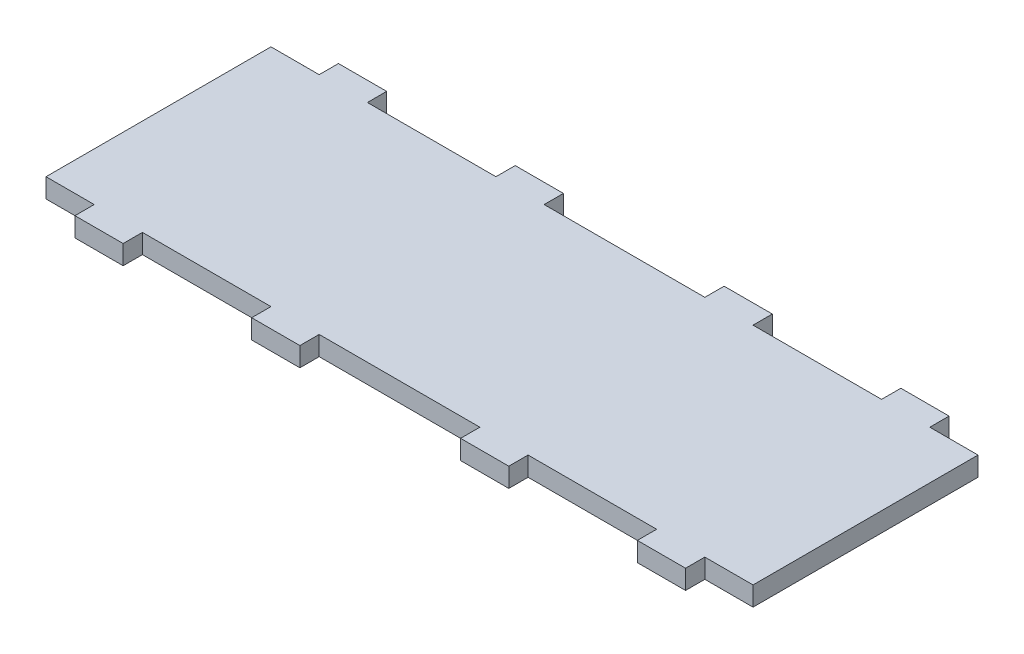
ISO-10303-21;
HEADER;
FILE_DESCRIPTION(('STEP AP214'),'2;1');
FILE_NAME('part.step','',(''),(''),'','','');
FILE_SCHEMA(('AUTOMOTIVE_DESIGN { 1 0 10303 214 1 1 1 1 }'));
ENDSEC;
DATA;
#1=APPLICATION_CONTEXT('core data for automotive mechanical design processes');
#2=APPLICATION_PROTOCOL_DEFINITION('international standard','automotive_design',2000,#1);
#3=PRODUCT_CONTEXT('',#1,'mechanical');
#4=PRODUCT('Part','Part','',(#3));
#5=PRODUCT_RELATED_PRODUCT_CATEGORY('part','',(#4));
#6=PRODUCT_DEFINITION_FORMATION('','',#4);
#7=PRODUCT_DEFINITION_CONTEXT('part definition',#1,'design');
#8=PRODUCT_DEFINITION('design','',#6,#7);
#9=PRODUCT_DEFINITION_SHAPE('','',#8);
#10=(LENGTH_UNIT() NAMED_UNIT(*) SI_UNIT(.MILLI.,.METRE.));
#11=(NAMED_UNIT(*) PLANE_ANGLE_UNIT() SI_UNIT($,.RADIAN.));
#12=(NAMED_UNIT(*) SI_UNIT($,.STERADIAN.) SOLID_ANGLE_UNIT());
#13=UNCERTAINTY_MEASURE_WITH_UNIT(LENGTH_MEASURE(1.E-05),#10,'distance_accuracy_value','');
#14=(GEOMETRIC_REPRESENTATION_CONTEXT(3) GLOBAL_UNCERTAINTY_ASSIGNED_CONTEXT((#13)) GLOBAL_UNIT_ASSIGNED_CONTEXT((#10,
#11,#12)) REPRESENTATION_CONTEXT('',''));
#15=CARTESIAN_POINT('',(0.,0.,0.));
#16=DIRECTION('',(0.,0.,1.));
#17=DIRECTION('',(1.,0.,0.));
#18=AXIS2_PLACEMENT_3D('',#15,#16,#17);
#19=CARTESIAN_POINT('',(-365.386748431959,6.,-70.));
#20=DIRECTION('',(1.,0.,0.));
#21=DIRECTION('',(0.,0.,-1.));
#22=AXIS2_PLACEMENT_3D('',#19,#20,#21);
#23=PLANE('',#22);
#24=DIRECTION('',(0.,0.,1.));
#25=VECTOR('',#24,1.);
#26=CARTESIAN_POINT('',(-365.386748431959,0.,-70.));
#27=LINE('',#26,#25);
#28=CARTESIAN_POINT('',(-365.386748431959,0.,-70.));
#29=VERTEX_POINT('',#28);
#30=CARTESIAN_POINT('',(-365.386748431959,0.,0.));
#31=VERTEX_POINT('',#30);
#32=EDGE_CURVE('E297',#29,#31,#27,.T.);
#33=ORIENTED_EDGE('',*,*,#32,.T.);
#34=DIRECTION('',(0.,-1.,0.));
#35=VECTOR('',#34,1.);
#36=CARTESIAN_POINT('',(-365.386748431959,6.,0.));
#37=LINE('',#36,#35);
#38=CARTESIAN_POINT('',(-365.386748431959,6.,0.));
#39=VERTEX_POINT('',#38);
#40=EDGE_CURVE('E11',#39,#31,#37,.T.);
#41=ORIENTED_EDGE('',*,*,#40,.F.);
#42=DIRECTION('',(0.,0.,1.));
#43=VECTOR('',#42,1.);
#44=CARTESIAN_POINT('',(-365.386748431959,6.,-70.));
#45=LINE('',#44,#43);
#46=CARTESIAN_POINT('',(-365.386748431959,6.,-70.));
#47=VERTEX_POINT('',#46);
#48=EDGE_CURVE('E367',#47,#39,#45,.T.);
#49=ORIENTED_EDGE('',*,*,#48,.F.);
#50=DIRECTION('',(0.,-1.,0.));
#51=VECTOR('',#50,1.);
#52=CARTESIAN_POINT('',(-365.386748431959,6.,-70.));
#53=LINE('',#52,#51);
#54=EDGE_CURVE('E293',#47,#29,#53,.T.);
#55=ORIENTED_EDGE('',*,*,#54,.T.);
#56=EDGE_LOOP('',(#33,#41,#49,#55));
#57=FACE_BOUND('',#56,.T.);
#58=ADVANCED_FACE('F33',(#57),#23,.F.);
#59=CARTESIAN_POINT('',(-365.386748431959,6.,0.));
#60=DIRECTION('',(0.,0.,-1.));
#61=DIRECTION('',(-1.,0.,0.));
#62=AXIS2_PLACEMENT_3D('',#59,#60,#61);
#63=PLANE('',#62);
#64=DIRECTION('',(1.,0.,0.));
#65=VECTOR('',#64,1.);
#66=CARTESIAN_POINT('',(-365.386748431959,0.,0.));
#67=LINE('',#66,#65);
#68=CARTESIAN_POINT('',(-350.386748431959,0.,0.));
#69=VERTEX_POINT('',#68);
#70=EDGE_CURVE('E300',#31,#69,#67,.T.);
#71=ORIENTED_EDGE('',*,*,#70,.T.);
#72=DIRECTION('',(0.,-1.,0.));
#73=VECTOR('',#72,1.);
#74=CARTESIAN_POINT('',(-350.386748431959,6.,0.));
#75=LINE('',#74,#73);
#76=CARTESIAN_POINT('',(-350.386748431959,6.,0.));
#77=VERTEX_POINT('',#76);
#78=EDGE_CURVE('E41',#77,#69,#75,.T.);
#79=ORIENTED_EDGE('',*,*,#78,.F.);
#80=DIRECTION('',(1.,0.,0.));
#81=VECTOR('',#80,1.);
#82=CARTESIAN_POINT('',(-365.386748431959,6.,0.));
#83=LINE('',#82,#81);
#84=EDGE_CURVE('E176',#39,#77,#83,.T.);
#85=ORIENTED_EDGE('',*,*,#84,.F.);
#86=ORIENTED_EDGE('',*,*,#40,.T.);
#87=EDGE_LOOP('',(#71,#79,#85,#86));
#88=FACE_BOUND('',#87,.T.);
#89=ADVANCED_FACE('F565',(#88),#63,.F.);
#90=CARTESIAN_POINT('',(-350.386748431959,6.,0.));
#91=DIRECTION('',(1.,0.,0.));
#92=DIRECTION('',(0.,0.,-1.));
#93=AXIS2_PLACEMENT_3D('',#90,#91,#92);
#94=PLANE('',#93);
#95=DIRECTION('',(0.,0.,1.));
#96=VECTOR('',#95,1.);
#97=CARTESIAN_POINT('',(-350.386748431959,0.,0.));
#98=LINE('',#97,#96);
#99=CARTESIAN_POINT('',(-350.386748431959,0.,6.));
#100=VERTEX_POINT('',#99);
#101=EDGE_CURVE('E302',#69,#100,#98,.T.);
#102=ORIENTED_EDGE('',*,*,#101,.T.);
#103=DIRECTION('',(0.,-1.,0.));
#104=VECTOR('',#103,1.);
#105=CARTESIAN_POINT('',(-350.386748431959,6.,6.));
#106=LINE('',#105,#104);
#107=CARTESIAN_POINT('',(-350.386748431959,6.,6.));
#108=VERTEX_POINT('',#107);
#109=EDGE_CURVE('E458',#108,#100,#106,.T.);
#110=ORIENTED_EDGE('',*,*,#109,.F.);
#111=DIRECTION('',(0.,0.,1.));
#112=VECTOR('',#111,1.);
#113=CARTESIAN_POINT('',(-350.386748431959,6.,0.));
#114=LINE('',#113,#112);
#115=EDGE_CURVE('E466',#77,#108,#114,.T.);
#116=ORIENTED_EDGE('',*,*,#115,.F.);
#117=ORIENTED_EDGE('',*,*,#78,.T.);
#118=EDGE_LOOP('',(#102,#110,#116,#117));
#119=FACE_BOUND('',#118,.T.);
#120=ADVANCED_FACE('F464',(#119),#94,.F.);
#121=CARTESIAN_POINT('',(-350.386748431959,6.,6.));
#122=DIRECTION('',(0.,0.,-1.));
#123=DIRECTION('',(-1.,0.,0.));
#124=AXIS2_PLACEMENT_3D('',#121,#122,#123);
#125=PLANE('',#124);
#126=DIRECTION('',(1.,0.,0.));
#127=VECTOR('',#126,1.);
#128=CARTESIAN_POINT('',(-350.386748431959,0.,6.));
#129=LINE('',#128,#127);
#130=CARTESIAN_POINT('',(-335.386748431959,0.,6.));
#131=VERTEX_POINT('',#130);
#132=EDGE_CURVE('E304',#100,#131,#129,.T.);
#133=ORIENTED_EDGE('',*,*,#132,.T.);
#134=DIRECTION('',(0.,-1.,0.));
#135=VECTOR('',#134,1.);
#136=CARTESIAN_POINT('',(-335.386748431959,6.,6.));
#137=LINE('',#136,#135);
#138=CARTESIAN_POINT('',(-335.386748431959,6.,6.));
#139=VERTEX_POINT('',#138);
#140=EDGE_CURVE('E455',#139,#131,#137,.T.);
#141=ORIENTED_EDGE('',*,*,#140,.F.);
#142=DIRECTION('',(1.,0.,0.));
#143=VECTOR('',#142,1.);
#144=CARTESIAN_POINT('',(-350.386748431959,6.,6.));
#145=LINE('',#144,#143);
#146=EDGE_CURVE('E484',#108,#139,#145,.T.);
#147=ORIENTED_EDGE('',*,*,#146,.F.);
#148=ORIENTED_EDGE('',*,*,#109,.T.);
#149=EDGE_LOOP('',(#133,#141,#147,#148));
#150=FACE_BOUND('',#149,.T.);
#151=ADVANCED_FACE('F475',(#150),#125,.F.);
#152=CARTESIAN_POINT('',(-335.386748431959,6.,0.));
#153=DIRECTION('',(-1.,0.,0.));
#154=DIRECTION('',(0.,0.,1.));
#155=AXIS2_PLACEMENT_3D('',#152,#153,#154);
#156=PLANE('',#155);
#157=DIRECTION('',(0.,0.,-1.));
#158=VECTOR('',#157,1.);
#159=CARTESIAN_POINT('',(-335.386748431959,0.,0.));
#160=LINE('',#159,#158);
#161=CARTESIAN_POINT('',(-335.386748431959,0.,0.));
#162=VERTEX_POINT('',#161);
#163=EDGE_CURVE('E306',#131,#162,#160,.T.);
#164=ORIENTED_EDGE('',*,*,#163,.T.);
#165=DIRECTION('',(0.,-1.,0.));
#166=VECTOR('',#165,1.);
#167=CARTESIAN_POINT('',(-335.386748431959,6.,0.));
#168=LINE('',#167,#166);
#169=CARTESIAN_POINT('',(-335.386748431959,6.,0.));
#170=VERTEX_POINT('',#169);
#171=EDGE_CURVE('E452',#170,#162,#168,.T.);
#172=ORIENTED_EDGE('',*,*,#171,.F.);
#173=DIRECTION('',(0.,0.,-1.));
#174=VECTOR('',#173,1.);
#175=CARTESIAN_POINT('',(-335.386748431959,6.,0.));
#176=LINE('',#175,#174);
#177=EDGE_CURVE('E481',#139,#170,#176,.T.);
#178=ORIENTED_EDGE('',*,*,#177,.F.);
#179=ORIENTED_EDGE('',*,*,#140,.T.);
#180=EDGE_LOOP('',(#164,#172,#178,#179));
#181=FACE_BOUND('',#180,.T.);
#182=ADVANCED_FACE('F479',(#181),#156,.F.);
#183=CARTESIAN_POINT('',(-335.386748431959,6.,0.));
#184=DIRECTION('',(0.,0.,-1.));
#185=DIRECTION('',(-1.,0.,0.));
#186=AXIS2_PLACEMENT_3D('',#183,#184,#185);
#187=PLANE('',#186);
#188=DIRECTION('',(1.,0.,0.));
#189=VECTOR('',#188,1.);
#190=CARTESIAN_POINT('',(-335.386748431959,0.,0.));
#191=LINE('',#190,#189);
#192=CARTESIAN_POINT('',(-295.386748431959,0.,0.));
#193=VERTEX_POINT('',#192);
#194=EDGE_CURVE('E308',#162,#193,#191,.T.);
#195=ORIENTED_EDGE('',*,*,#194,.T.);
#196=DIRECTION('',(0.,-1.,0.));
#197=VECTOR('',#196,1.);
#198=CARTESIAN_POINT('',(-295.386748431959,6.,0.));
#199=LINE('',#198,#197);
#200=CARTESIAN_POINT('',(-295.386748431959,6.,0.));
#201=VERTEX_POINT('',#200);
#202=EDGE_CURVE('E449',#201,#193,#199,.T.);
#203=ORIENTED_EDGE('',*,*,#202,.F.);
#204=DIRECTION('',(1.,0.,0.));
#205=VECTOR('',#204,1.);
#206=CARTESIAN_POINT('',(-335.386748431959,6.,0.));
#207=LINE('',#206,#205);
#208=EDGE_CURVE('E483',#170,#201,#207,.T.);
#209=ORIENTED_EDGE('',*,*,#208,.F.);
#210=ORIENTED_EDGE('',*,*,#171,.T.);
#211=EDGE_LOOP('',(#195,#203,#209,#210));
#212=FACE_BOUND('',#211,.T.);
#213=ADVANCED_FACE('F578',(#212),#187,.F.);
#214=CARTESIAN_POINT('',(-295.386748431959,6.,0.));
#215=DIRECTION('',(1.,0.,0.));
#216=DIRECTION('',(0.,0.,-1.));
#217=AXIS2_PLACEMENT_3D('',#214,#215,#216);
#218=PLANE('',#217);
#219=DIRECTION('',(0.,0.,1.));
#220=VECTOR('',#219,1.);
#221=CARTESIAN_POINT('',(-295.386748431959,0.,0.));
#222=LINE('',#221,#220);
#223=CARTESIAN_POINT('',(-295.386748431959,0.,6.));
#224=VERTEX_POINT('',#223);
#225=EDGE_CURVE('E310',#193,#224,#222,.T.);
#226=ORIENTED_EDGE('',*,*,#225,.T.);
#227=DIRECTION('',(0.,-1.,0.));
#228=VECTOR('',#227,1.);
#229=CARTESIAN_POINT('',(-295.386748431959,6.,6.));
#230=LINE('',#229,#228);
#231=CARTESIAN_POINT('',(-295.386748431959,6.,6.));
#232=VERTEX_POINT('',#231);
#233=EDGE_CURVE('E446',#232,#224,#230,.T.);
#234=ORIENTED_EDGE('',*,*,#233,.F.);
#235=DIRECTION('',(0.,0.,1.));
#236=VECTOR('',#235,1.);
#237=CARTESIAN_POINT('',(-295.386748431959,6.,0.));
#238=LINE('',#237,#236);
#239=EDGE_CURVE('E486',#201,#232,#238,.T.);
#240=ORIENTED_EDGE('',*,*,#239,.F.);
#241=ORIENTED_EDGE('',*,*,#202,.T.);
#242=EDGE_LOOP('',(#226,#234,#240,#241));
#243=FACE_BOUND('',#242,.T.);
#244=ADVANCED_FACE('F581',(#243),#218,.F.);
#245=CARTESIAN_POINT('',(-295.386748431959,6.,6.));
#246=DIRECTION('',(0.,0.,-1.));
#247=DIRECTION('',(-1.,0.,0.));
#248=AXIS2_PLACEMENT_3D('',#245,#246,#247);
#249=PLANE('',#248);
#250=DIRECTION('',(1.,0.,0.));
#251=VECTOR('',#250,1.);
#252=CARTESIAN_POINT('',(-295.386748431959,0.,6.));
#253=LINE('',#252,#251);
#254=CARTESIAN_POINT('',(-280.386748431959,0.,6.));
#255=VERTEX_POINT('',#254);
#256=EDGE_CURVE('E312',#224,#255,#253,.T.);
#257=ORIENTED_EDGE('',*,*,#256,.T.);
#258=DIRECTION('',(0.,-1.,0.));
#259=VECTOR('',#258,1.);
#260=CARTESIAN_POINT('',(-280.386748431959,6.,6.));
#261=LINE('',#260,#259);
#262=CARTESIAN_POINT('',(-280.386748431959,6.,6.));
#263=VERTEX_POINT('',#262);
#264=EDGE_CURVE('E443',#263,#255,#261,.T.);
#265=ORIENTED_EDGE('',*,*,#264,.F.);
#266=DIRECTION('',(1.,0.,0.));
#267=VECTOR('',#266,1.);
#268=CARTESIAN_POINT('',(-295.386748431959,6.,6.));
#269=LINE('',#268,#267);
#270=EDGE_CURVE('E492',#232,#263,#269,.T.);
#271=ORIENTED_EDGE('',*,*,#270,.F.);
#272=ORIENTED_EDGE('',*,*,#233,.T.);
#273=EDGE_LOOP('',(#257,#265,#271,#272));
#274=FACE_BOUND('',#273,.T.);
#275=ADVANCED_FACE('F585',(#274),#249,.F.);
#276=CARTESIAN_POINT('',(-280.386748431959,6.,0.));
#277=DIRECTION('',(-1.,0.,0.));
#278=DIRECTION('',(0.,0.,1.));
#279=AXIS2_PLACEMENT_3D('',#276,#277,#278);
#280=PLANE('',#279);
#281=DIRECTION('',(0.,0.,-1.));
#282=VECTOR('',#281,1.);
#283=CARTESIAN_POINT('',(-280.386748431959,0.,0.));
#284=LINE('',#283,#282);
#285=CARTESIAN_POINT('',(-280.386748431959,0.,0.));
#286=VERTEX_POINT('',#285);
#287=EDGE_CURVE('E314',#255,#286,#284,.T.);
#288=ORIENTED_EDGE('',*,*,#287,.T.);
#289=DIRECTION('',(0.,-1.,0.));
#290=VECTOR('',#289,1.);
#291=CARTESIAN_POINT('',(-280.386748431959,6.,0.));
#292=LINE('',#291,#290);
#293=CARTESIAN_POINT('',(-280.386748431959,6.,0.));
#294=VERTEX_POINT('',#293);
#295=EDGE_CURVE('E440',#294,#286,#292,.T.);
#296=ORIENTED_EDGE('',*,*,#295,.F.);
#297=DIRECTION('',(0.,0.,-1.));
#298=VECTOR('',#297,1.);
#299=CARTESIAN_POINT('',(-280.386748431959,6.,0.));
#300=LINE('',#299,#298);
#301=EDGE_CURVE('E494',#263,#294,#300,.T.);
#302=ORIENTED_EDGE('',*,*,#301,.F.);
#303=ORIENTED_EDGE('',*,*,#264,.T.);
#304=EDGE_LOOP('',(#288,#296,#302,#303));
#305=FACE_BOUND('',#304,.T.);
#306=ADVANCED_FACE('F589',(#305),#280,.F.);
#307=CARTESIAN_POINT('',(-280.386748431959,6.,0.));
#308=DIRECTION('',(0.,0.,-1.));
#309=DIRECTION('',(-1.,0.,0.));
#310=AXIS2_PLACEMENT_3D('',#307,#308,#309);
#311=PLANE('',#310);
#312=DIRECTION('',(1.,0.,0.));
#313=VECTOR('',#312,1.);
#314=CARTESIAN_POINT('',(-280.386748431959,0.,0.));
#315=LINE('',#314,#313);
#316=CARTESIAN_POINT('',(-230.386748431959,0.,0.));
#317=VERTEX_POINT('',#316);
#318=EDGE_CURVE('E316',#286,#317,#315,.T.);
#319=ORIENTED_EDGE('',*,*,#318,.T.);
#320=DIRECTION('',(0.,-1.,0.));
#321=VECTOR('',#320,1.);
#322=CARTESIAN_POINT('',(-230.386748431959,6.,0.));
#323=LINE('',#322,#321);
#324=CARTESIAN_POINT('',(-230.386748431959,6.,0.));
#325=VERTEX_POINT('',#324);
#326=EDGE_CURVE('E437',#325,#317,#323,.T.);
#327=ORIENTED_EDGE('',*,*,#326,.F.);
#328=DIRECTION('',(1.,0.,0.));
#329=VECTOR('',#328,1.);
#330=CARTESIAN_POINT('',(-280.386748431959,6.,0.));
#331=LINE('',#330,#329);
#332=EDGE_CURVE('E496',#294,#325,#331,.T.);
#333=ORIENTED_EDGE('',*,*,#332,.F.);
#334=ORIENTED_EDGE('',*,*,#295,.T.);
#335=EDGE_LOOP('',(#319,#327,#333,#334));
#336=FACE_BOUND('',#335,.T.);
#337=ADVANCED_FACE('F593',(#336),#311,.F.);
#338=CARTESIAN_POINT('',(-230.386748431959,6.,0.));
#339=DIRECTION('',(1.,0.,0.));
#340=DIRECTION('',(0.,0.,-1.));
#341=AXIS2_PLACEMENT_3D('',#338,#339,#340);
#342=PLANE('',#341);
#343=DIRECTION('',(0.,0.,1.));
#344=VECTOR('',#343,1.);
#345=CARTESIAN_POINT('',(-230.386748431959,0.,0.));
#346=LINE('',#345,#344);
#347=CARTESIAN_POINT('',(-230.386748431959,0.,5.99999999999989));
#348=VERTEX_POINT('',#347);
#349=EDGE_CURVE('E318',#317,#348,#346,.T.);
#350=ORIENTED_EDGE('',*,*,#349,.T.);
#351=DIRECTION('',(0.,-1.,0.));
#352=VECTOR('',#351,1.);
#353=CARTESIAN_POINT('',(-230.386748431959,6.,5.99999999999989));
#354=LINE('',#353,#352);
#355=CARTESIAN_POINT('',(-230.386748431959,6.,5.99999999999989));
#356=VERTEX_POINT('',#355);
#357=EDGE_CURVE('E434',#356,#348,#354,.T.);
#358=ORIENTED_EDGE('',*,*,#357,.F.);
#359=DIRECTION('',(0.,0.,1.));
#360=VECTOR('',#359,1.);
#361=CARTESIAN_POINT('',(-230.386748431959,6.,0.));
#362=LINE('',#361,#360);
#363=EDGE_CURVE('E498',#325,#356,#362,.T.);
#364=ORIENTED_EDGE('',*,*,#363,.F.);
#365=ORIENTED_EDGE('',*,*,#326,.T.);
#366=EDGE_LOOP('',(#350,#358,#364,#365));
#367=FACE_BOUND('',#366,.T.);
#368=ADVANCED_FACE('F597',(#367),#342,.F.);
#369=CARTESIAN_POINT('',(-230.386748431959,6.,5.99999999999989));
#370=DIRECTION('',(0.,0.,-1.));
#371=DIRECTION('',(-1.,0.,0.));
#372=AXIS2_PLACEMENT_3D('',#369,#370,#371);
#373=PLANE('',#372);
#374=DIRECTION('',(1.,0.,0.));
#375=VECTOR('',#374,1.);
#376=CARTESIAN_POINT('',(-230.386748431959,0.,5.99999999999989));
#377=LINE('',#376,#375);
#378=CARTESIAN_POINT('',(-215.386748431959,0.,5.99999999999989));
#379=VERTEX_POINT('',#378);
#380=EDGE_CURVE('E320',#348,#379,#377,.T.);
#381=ORIENTED_EDGE('',*,*,#380,.T.);
#382=DIRECTION('',(0.,-1.,0.));
#383=VECTOR('',#382,1.);
#384=CARTESIAN_POINT('',(-215.386748431959,6.,5.99999999999989));
#385=LINE('',#384,#383);
#386=CARTESIAN_POINT('',(-215.386748431959,6.,5.99999999999989));
#387=VERTEX_POINT('',#386);
#388=EDGE_CURVE('E431',#387,#379,#385,.T.);
#389=ORIENTED_EDGE('',*,*,#388,.F.);
#390=DIRECTION('',(1.,0.,0.));
#391=VECTOR('',#390,1.);
#392=CARTESIAN_POINT('',(-230.386748431959,6.,5.99999999999989));
#393=LINE('',#392,#391);
#394=EDGE_CURVE('E500',#356,#387,#393,.T.);
#395=ORIENTED_EDGE('',*,*,#394,.F.);
#396=ORIENTED_EDGE('',*,*,#357,.T.);
#397=EDGE_LOOP('',(#381,#389,#395,#396));
#398=FACE_BOUND('',#397,.T.);
#399=ADVANCED_FACE('F601',(#398),#373,.F.);
#400=CARTESIAN_POINT('',(-215.386748431959,6.,0.));
#401=DIRECTION('',(-1.,0.,0.));
#402=DIRECTION('',(0.,0.,1.));
#403=AXIS2_PLACEMENT_3D('',#400,#401,#402);
#404=PLANE('',#403);
#405=DIRECTION('',(0.,0.,-1.));
#406=VECTOR('',#405,1.);
#407=CARTESIAN_POINT('',(-215.386748431959,0.,0.));
#408=LINE('',#407,#406);
#409=CARTESIAN_POINT('',(-215.386748431959,0.,0.));
#410=VERTEX_POINT('',#409);
#411=EDGE_CURVE('E322',#379,#410,#408,.T.);
#412=ORIENTED_EDGE('',*,*,#411,.T.);
#413=DIRECTION('',(0.,-1.,0.));
#414=VECTOR('',#413,1.);
#415=CARTESIAN_POINT('',(-215.386748431959,6.,0.));
#416=LINE('',#415,#414);
#417=CARTESIAN_POINT('',(-215.386748431959,6.,0.));
#418=VERTEX_POINT('',#417);
#419=EDGE_CURVE('E428',#418,#410,#416,.T.);
#420=ORIENTED_EDGE('',*,*,#419,.F.);
#421=DIRECTION('',(0.,0.,-1.));
#422=VECTOR('',#421,1.);
#423=CARTESIAN_POINT('',(-215.386748431959,6.,0.));
#424=LINE('',#423,#422);
#425=EDGE_CURVE('E502',#387,#418,#424,.T.);
#426=ORIENTED_EDGE('',*,*,#425,.F.);
#427=ORIENTED_EDGE('',*,*,#388,.T.);
#428=EDGE_LOOP('',(#412,#420,#426,#427));
#429=FACE_BOUND('',#428,.T.);
#430=ADVANCED_FACE('F605',(#429),#404,.F.);
#431=CARTESIAN_POINT('',(-215.386748431959,6.,0.));
#432=DIRECTION('',(0.,0.,-1.));
#433=DIRECTION('',(-1.,0.,0.));
#434=AXIS2_PLACEMENT_3D('',#431,#432,#433);
#435=PLANE('',#434);
#436=DIRECTION('',(1.,0.,0.));
#437=VECTOR('',#436,1.);
#438=CARTESIAN_POINT('',(-215.386748431959,0.,0.));
#439=LINE('',#438,#437);
#440=CARTESIAN_POINT('',(-175.386748431959,0.,0.));
#441=VERTEX_POINT('',#440);
#442=EDGE_CURVE('E324',#410,#441,#439,.T.);
#443=ORIENTED_EDGE('',*,*,#442,.T.);
#444=DIRECTION('',(0.,-1.,0.));
#445=VECTOR('',#444,1.);
#446=CARTESIAN_POINT('',(-175.386748431959,6.,0.));
#447=LINE('',#446,#445);
#448=CARTESIAN_POINT('',(-175.386748431959,6.,0.));
#449=VERTEX_POINT('',#448);
#450=EDGE_CURVE('E425',#449,#441,#447,.T.);
#451=ORIENTED_EDGE('',*,*,#450,.F.);
#452=DIRECTION('',(1.,0.,0.));
#453=VECTOR('',#452,1.);
#454=CARTESIAN_POINT('',(-215.386748431959,6.,0.));
#455=LINE('',#454,#453);
#456=EDGE_CURVE('E504',#418,#449,#455,.T.);
#457=ORIENTED_EDGE('',*,*,#456,.F.);
#458=ORIENTED_EDGE('',*,*,#419,.T.);
#459=EDGE_LOOP('',(#443,#451,#457,#458));
#460=FACE_BOUND('',#459,.T.);
#461=ADVANCED_FACE('F609',(#460),#435,.F.);
#462=CARTESIAN_POINT('',(-175.386748431959,6.,0.));
#463=DIRECTION('',(1.,0.,0.));
#464=DIRECTION('',(0.,0.,-1.));
#465=AXIS2_PLACEMENT_3D('',#462,#463,#464);
#466=PLANE('',#465);
#467=DIRECTION('',(0.,0.,1.));
#468=VECTOR('',#467,1.);
#469=CARTESIAN_POINT('',(-175.386748431959,0.,0.));
#470=LINE('',#469,#468);
#471=CARTESIAN_POINT('',(-175.386748431959,0.,5.99999999999994));
#472=VERTEX_POINT('',#471);
#473=EDGE_CURVE('E326',#441,#472,#470,.T.);
#474=ORIENTED_EDGE('',*,*,#473,.T.);
#475=DIRECTION('',(0.,-1.,0.));
#476=VECTOR('',#475,1.);
#477=CARTESIAN_POINT('',(-175.386748431959,6.,5.99999999999994));
#478=LINE('',#477,#476);
#479=CARTESIAN_POINT('',(-175.386748431959,6.,5.99999999999994));
#480=VERTEX_POINT('',#479);
#481=EDGE_CURVE('E422',#480,#472,#478,.T.);
#482=ORIENTED_EDGE('',*,*,#481,.F.);
#483=DIRECTION('',(0.,0.,1.));
#484=VECTOR('',#483,1.);
#485=CARTESIAN_POINT('',(-175.386748431959,6.,0.));
#486=LINE('',#485,#484);
#487=EDGE_CURVE('E506',#449,#480,#486,.T.);
#488=ORIENTED_EDGE('',*,*,#487,.F.);
#489=ORIENTED_EDGE('',*,*,#450,.T.);
#490=EDGE_LOOP('',(#474,#482,#488,#489));
#491=FACE_BOUND('',#490,.T.);
#492=ADVANCED_FACE('F613',(#491),#466,.F.);
#493=CARTESIAN_POINT('',(-175.386748431959,6.,5.99999999999994));
#494=DIRECTION('',(0.,0.,-1.));
#495=DIRECTION('',(-1.,0.,0.));
#496=AXIS2_PLACEMENT_3D('',#493,#494,#495);
#497=PLANE('',#496);
#498=DIRECTION('',(1.,0.,0.));
#499=VECTOR('',#498,1.);
#500=CARTESIAN_POINT('',(-175.386748431959,0.,5.99999999999994));
#501=LINE('',#500,#499);
#502=CARTESIAN_POINT('',(-160.386748431959,0.,5.99999999999994));
#503=VERTEX_POINT('',#502);
#504=EDGE_CURVE('E328',#472,#503,#501,.T.);
#505=ORIENTED_EDGE('',*,*,#504,.T.);
#506=DIRECTION('',(0.,-1.,0.));
#507=VECTOR('',#506,1.);
#508=CARTESIAN_POINT('',(-160.386748431959,6.,5.99999999999994));
#509=LINE('',#508,#507);
#510=CARTESIAN_POINT('',(-160.386748431959,6.,5.99999999999994));
#511=VERTEX_POINT('',#510);
#512=EDGE_CURVE('E419',#511,#503,#509,.T.);
#513=ORIENTED_EDGE('',*,*,#512,.F.);
#514=DIRECTION('',(1.,0.,0.));
#515=VECTOR('',#514,1.);
#516=CARTESIAN_POINT('',(-175.386748431959,6.,5.99999999999994));
#517=LINE('',#516,#515);
#518=EDGE_CURVE('E508',#480,#511,#517,.T.);
#519=ORIENTED_EDGE('',*,*,#518,.F.);
#520=ORIENTED_EDGE('',*,*,#481,.T.);
#521=EDGE_LOOP('',(#505,#513,#519,#520));
#522=FACE_BOUND('',#521,.T.);
#523=ADVANCED_FACE('F617',(#522),#497,.F.);
#524=CARTESIAN_POINT('',(-160.386748431959,6.,0.));
#525=DIRECTION('',(-1.,0.,0.));
#526=DIRECTION('',(0.,0.,1.));
#527=AXIS2_PLACEMENT_3D('',#524,#525,#526);
#528=PLANE('',#527);
#529=DIRECTION('',(0.,0.,-1.));
#530=VECTOR('',#529,1.);
#531=CARTESIAN_POINT('',(-160.386748431959,0.,0.));
#532=LINE('',#531,#530);
#533=CARTESIAN_POINT('',(-160.386748431959,0.,0.));
#534=VERTEX_POINT('',#533);
#535=EDGE_CURVE('E330',#503,#534,#532,.T.);
#536=ORIENTED_EDGE('',*,*,#535,.T.);
#537=DIRECTION('',(0.,-1.,0.));
#538=VECTOR('',#537,1.);
#539=CARTESIAN_POINT('',(-160.386748431959,6.,0.));
#540=LINE('',#539,#538);
#541=CARTESIAN_POINT('',(-160.386748431959,6.,0.));
#542=VERTEX_POINT('',#541);
#543=EDGE_CURVE('E416',#542,#534,#540,.T.);
#544=ORIENTED_EDGE('',*,*,#543,.F.);
#545=DIRECTION('',(0.,0.,-1.));
#546=VECTOR('',#545,1.);
#547=CARTESIAN_POINT('',(-160.386748431959,6.,0.));
#548=LINE('',#547,#546);
#549=EDGE_CURVE('E510',#511,#542,#548,.T.);
#550=ORIENTED_EDGE('',*,*,#549,.F.);
#551=ORIENTED_EDGE('',*,*,#512,.T.);
#552=EDGE_LOOP('',(#536,#544,#550,#551));
#553=FACE_BOUND('',#552,.T.);
#554=ADVANCED_FACE('F621',(#553),#528,.F.);
#555=CARTESIAN_POINT('',(-160.386748431959,6.,0.));
#556=DIRECTION('',(0.,0.,-1.));
#557=DIRECTION('',(-1.,0.,0.));
#558=AXIS2_PLACEMENT_3D('',#555,#556,#557);
#559=PLANE('',#558);
#560=DIRECTION('',(1.,0.,0.));
#561=VECTOR('',#560,1.);
#562=CARTESIAN_POINT('',(-160.386748431959,0.,0.));
#563=LINE('',#562,#561);
#564=CARTESIAN_POINT('',(-145.386748431959,0.,0.));
#565=VERTEX_POINT('',#564);
#566=EDGE_CURVE('E332',#534,#565,#563,.T.);
#567=ORIENTED_EDGE('',*,*,#566,.T.);
#568=DIRECTION('',(0.,-1.,0.));
#569=VECTOR('',#568,1.);
#570=CARTESIAN_POINT('',(-145.386748431959,6.,0.));
#571=LINE('',#570,#569);
#572=CARTESIAN_POINT('',(-145.386748431959,6.,0.));
#573=VERTEX_POINT('',#572);
#574=EDGE_CURVE('E413',#573,#565,#571,.T.);
#575=ORIENTED_EDGE('',*,*,#574,.F.);
#576=DIRECTION('',(1.,0.,0.));
#577=VECTOR('',#576,1.);
#578=CARTESIAN_POINT('',(-160.386748431959,6.,0.));
#579=LINE('',#578,#577);
#580=EDGE_CURVE('E512',#542,#573,#579,.T.);
#581=ORIENTED_EDGE('',*,*,#580,.F.);
#582=ORIENTED_EDGE('',*,*,#543,.T.);
#583=EDGE_LOOP('',(#567,#575,#581,#582));
#584=FACE_BOUND('',#583,.T.);
#585=ADVANCED_FACE('F625',(#584),#559,.F.);
#586=CARTESIAN_POINT('',(-145.386748431959,6.,-70.));
#587=DIRECTION('',(-1.,0.,0.));
#588=DIRECTION('',(0.,0.,1.));
#589=AXIS2_PLACEMENT_3D('',#586,#587,#588);
#590=PLANE('',#589);
#591=DIRECTION('',(0.,0.,-1.));
#592=VECTOR('',#591,1.);
#593=CARTESIAN_POINT('',(-145.386748431959,0.,-70.));
#594=LINE('',#593,#592);
#595=CARTESIAN_POINT('',(-145.386748431959,0.,-70.));
#596=VERTEX_POINT('',#595);
#597=EDGE_CURVE('E334',#565,#596,#594,.T.);
#598=ORIENTED_EDGE('',*,*,#597,.T.);
#599=DIRECTION('',(0.,-1.,0.));
#600=VECTOR('',#599,1.);
#601=CARTESIAN_POINT('',(-145.386748431959,6.,-70.));
#602=LINE('',#601,#600);
#603=CARTESIAN_POINT('',(-145.386748431959,6.,-70.));
#604=VERTEX_POINT('',#603);
#605=EDGE_CURVE('E410',#604,#596,#602,.T.);
#606=ORIENTED_EDGE('',*,*,#605,.F.);
#607=DIRECTION('',(0.,0.,-1.));
#608=VECTOR('',#607,1.);
#609=CARTESIAN_POINT('',(-145.386748431959,6.,-70.));
#610=LINE('',#609,#608);
#611=EDGE_CURVE('E514',#573,#604,#610,.T.);
#612=ORIENTED_EDGE('',*,*,#611,.F.);
#613=ORIENTED_EDGE('',*,*,#574,.T.);
#614=EDGE_LOOP('',(#598,#606,#612,#613));
#615=FACE_BOUND('',#614,.T.);
#616=ADVANCED_FACE('F629',(#615),#590,.F.);
#617=CARTESIAN_POINT('',(-160.386748431959,6.,-70.));
#618=DIRECTION('',(0.,0.,1.));
#619=DIRECTION('',(1.,0.,0.));
#620=AXIS2_PLACEMENT_3D('',#617,#618,#619);
#621=PLANE('',#620);
#622=DIRECTION('',(-1.,0.,0.));
#623=VECTOR('',#622,1.);
#624=CARTESIAN_POINT('',(-160.386748431959,0.,-70.));
#625=LINE('',#624,#623);
#626=CARTESIAN_POINT('',(-160.386748431959,0.,-70.));
#627=VERTEX_POINT('',#626);
#628=EDGE_CURVE('E336',#596,#627,#625,.T.);
#629=ORIENTED_EDGE('',*,*,#628,.T.);
#630=DIRECTION('',(0.,-1.,0.));
#631=VECTOR('',#630,1.);
#632=CARTESIAN_POINT('',(-160.386748431959,6.,-70.));
#633=LINE('',#632,#631);
#634=CARTESIAN_POINT('',(-160.386748431959,6.,-70.));
#635=VERTEX_POINT('',#634);
#636=EDGE_CURVE('E407',#635,#627,#633,.T.);
#637=ORIENTED_EDGE('',*,*,#636,.F.);
#638=DIRECTION('',(-1.,0.,0.));
#639=VECTOR('',#638,1.);
#640=CARTESIAN_POINT('',(-160.386748431959,6.,-70.));
#641=LINE('',#640,#639);
#642=EDGE_CURVE('E516',#604,#635,#641,.T.);
#643=ORIENTED_EDGE('',*,*,#642,.F.);
#644=ORIENTED_EDGE('',*,*,#605,.T.);
#645=EDGE_LOOP('',(#629,#637,#643,#644));
#646=FACE_BOUND('',#645,.T.);
#647=ADVANCED_FACE('F633',(#646),#621,.F.);
#648=CARTESIAN_POINT('',(-160.386748431959,6.,-70.));
#649=DIRECTION('',(-1.,0.,0.));
#650=DIRECTION('',(0.,0.,1.));
#651=AXIS2_PLACEMENT_3D('',#648,#649,#650);
#652=PLANE('',#651);
#653=DIRECTION('',(0.,0.,-1.));
#654=VECTOR('',#653,1.);
#655=CARTESIAN_POINT('',(-160.386748431959,0.,-70.));
#656=LINE('',#655,#654);
#657=CARTESIAN_POINT('',(-160.386748431959,0.,-76.));
#658=VERTEX_POINT('',#657);
#659=EDGE_CURVE('E338',#627,#658,#656,.T.);
#660=ORIENTED_EDGE('',*,*,#659,.T.);
#661=DIRECTION('',(0.,-1.,0.));
#662=VECTOR('',#661,1.);
#663=CARTESIAN_POINT('',(-160.386748431959,6.,-76.));
#664=LINE('',#663,#662);
#665=CARTESIAN_POINT('',(-160.386748431959,6.,-76.));
#666=VERTEX_POINT('',#665);
#667=EDGE_CURVE('E404',#666,#658,#664,.T.);
#668=ORIENTED_EDGE('',*,*,#667,.F.);
#669=DIRECTION('',(0.,0.,-1.));
#670=VECTOR('',#669,1.);
#671=CARTESIAN_POINT('',(-160.386748431959,6.,-70.));
#672=LINE('',#671,#670);
#673=EDGE_CURVE('E518',#635,#666,#672,.T.);
#674=ORIENTED_EDGE('',*,*,#673,.F.);
#675=ORIENTED_EDGE('',*,*,#636,.T.);
#676=EDGE_LOOP('',(#660,#668,#674,#675));
#677=FACE_BOUND('',#676,.T.);
#678=ADVANCED_FACE('F637',(#677),#652,.F.);
#679=CARTESIAN_POINT('',(-175.386748431959,6.,-76.));
#680=DIRECTION('',(0.,0.,1.));
#681=DIRECTION('',(1.,0.,0.));
#682=AXIS2_PLACEMENT_3D('',#679,#680,#681);
#683=PLANE('',#682);
#684=DIRECTION('',(-1.,0.,0.));
#685=VECTOR('',#684,1.);
#686=CARTESIAN_POINT('',(-175.386748431959,0.,-76.));
#687=LINE('',#686,#685);
#688=CARTESIAN_POINT('',(-175.386748431959,0.,-76.));
#689=VERTEX_POINT('',#688);
#690=EDGE_CURVE('E340',#658,#689,#687,.T.);
#691=ORIENTED_EDGE('',*,*,#690,.T.);
#692=DIRECTION('',(0.,-1.,0.));
#693=VECTOR('',#692,1.);
#694=CARTESIAN_POINT('',(-175.386748431959,6.,-76.));
#695=LINE('',#694,#693);
#696=CARTESIAN_POINT('',(-175.386748431959,6.,-76.));
#697=VERTEX_POINT('',#696);
#698=EDGE_CURVE('E401',#697,#689,#695,.T.);
#699=ORIENTED_EDGE('',*,*,#698,.F.);
#700=DIRECTION('',(-1.,0.,0.));
#701=VECTOR('',#700,1.);
#702=CARTESIAN_POINT('',(-175.386748431959,6.,-76.));
#703=LINE('',#702,#701);
#704=EDGE_CURVE('E520',#666,#697,#703,.T.);
#705=ORIENTED_EDGE('',*,*,#704,.F.);
#706=ORIENTED_EDGE('',*,*,#667,.T.);
#707=EDGE_LOOP('',(#691,#699,#705,#706));
#708=FACE_BOUND('',#707,.T.);
#709=ADVANCED_FACE('F641',(#708),#683,.F.);
#710=CARTESIAN_POINT('',(-175.386748431959,6.,-70.));
#711=DIRECTION('',(1.,0.,0.));
#712=DIRECTION('',(0.,0.,-1.));
#713=AXIS2_PLACEMENT_3D('',#710,#711,#712);
#714=PLANE('',#713);
#715=DIRECTION('',(0.,0.,1.));
#716=VECTOR('',#715,1.);
#717=CARTESIAN_POINT('',(-175.386748431959,0.,-70.));
#718=LINE('',#717,#716);
#719=CARTESIAN_POINT('',(-175.386748431959,0.,-70.));
#720=VERTEX_POINT('',#719);
#721=EDGE_CURVE('E342',#689,#720,#718,.T.);
#722=ORIENTED_EDGE('',*,*,#721,.T.);
#723=DIRECTION('',(0.,-1.,0.));
#724=VECTOR('',#723,1.);
#725=CARTESIAN_POINT('',(-175.386748431959,6.,-70.));
#726=LINE('',#725,#724);
#727=CARTESIAN_POINT('',(-175.386748431959,6.,-70.));
#728=VERTEX_POINT('',#727);
#729=EDGE_CURVE('E398',#728,#720,#726,.T.);
#730=ORIENTED_EDGE('',*,*,#729,.F.);
#731=DIRECTION('',(0.,0.,1.));
#732=VECTOR('',#731,1.);
#733=CARTESIAN_POINT('',(-175.386748431959,6.,-70.));
#734=LINE('',#733,#732);
#735=EDGE_CURVE('E522',#697,#728,#734,.T.);
#736=ORIENTED_EDGE('',*,*,#735,.F.);
#737=ORIENTED_EDGE('',*,*,#698,.T.);
#738=EDGE_LOOP('',(#722,#730,#736,#737));
#739=FACE_BOUND('',#738,.T.);
#740=ADVANCED_FACE('F645',(#739),#714,.F.);
#741=CARTESIAN_POINT('',(-215.386748431959,6.,-70.));
#742=DIRECTION('',(0.,0.,1.));
#743=DIRECTION('',(1.,0.,0.));
#744=AXIS2_PLACEMENT_3D('',#741,#742,#743);
#745=PLANE('',#744);
#746=DIRECTION('',(-1.,0.,0.));
#747=VECTOR('',#746,1.);
#748=CARTESIAN_POINT('',(-215.386748431959,0.,-70.));
#749=LINE('',#748,#747);
#750=CARTESIAN_POINT('',(-215.386748431959,0.,-70.));
#751=VERTEX_POINT('',#750);
#752=EDGE_CURVE('E344',#720,#751,#749,.T.);
#753=ORIENTED_EDGE('',*,*,#752,.T.);
#754=DIRECTION('',(0.,-1.,0.));
#755=VECTOR('',#754,1.);
#756=CARTESIAN_POINT('',(-215.386748431959,6.,-70.));
#757=LINE('',#756,#755);
#758=CARTESIAN_POINT('',(-215.386748431959,6.,-70.));
#759=VERTEX_POINT('',#758);
#760=EDGE_CURVE('E395',#759,#751,#757,.T.);
#761=ORIENTED_EDGE('',*,*,#760,.F.);
#762=DIRECTION('',(-1.,0.,0.));
#763=VECTOR('',#762,1.);
#764=CARTESIAN_POINT('',(-215.386748431959,6.,-70.));
#765=LINE('',#764,#763);
#766=EDGE_CURVE('E524',#728,#759,#765,.T.);
#767=ORIENTED_EDGE('',*,*,#766,.F.);
#768=ORIENTED_EDGE('',*,*,#729,.T.);
#769=EDGE_LOOP('',(#753,#761,#767,#768));
#770=FACE_BOUND('',#769,.T.);
#771=ADVANCED_FACE('F649',(#770),#745,.F.);
#772=CARTESIAN_POINT('',(-215.386748431959,6.,-70.));
#773=DIRECTION('',(-1.,0.,0.));
#774=DIRECTION('',(0.,0.,1.));
#775=AXIS2_PLACEMENT_3D('',#772,#773,#774);
#776=PLANE('',#775);
#777=DIRECTION('',(0.,0.,-1.));
#778=VECTOR('',#777,1.);
#779=CARTESIAN_POINT('',(-215.386748431959,0.,-70.));
#780=LINE('',#779,#778);
#781=CARTESIAN_POINT('',(-215.386748431959,0.,-76.));
#782=VERTEX_POINT('',#781);
#783=EDGE_CURVE('E346',#751,#782,#780,.T.);
#784=ORIENTED_EDGE('',*,*,#783,.T.);
#785=DIRECTION('',(0.,-1.,0.));
#786=VECTOR('',#785,1.);
#787=CARTESIAN_POINT('',(-215.386748431959,6.,-76.));
#788=LINE('',#787,#786);
#789=CARTESIAN_POINT('',(-215.386748431959,6.,-76.));
#790=VERTEX_POINT('',#789);
#791=EDGE_CURVE('E392',#790,#782,#788,.T.);
#792=ORIENTED_EDGE('',*,*,#791,.F.);
#793=DIRECTION('',(0.,0.,-1.));
#794=VECTOR('',#793,1.);
#795=CARTESIAN_POINT('',(-215.386748431959,6.,-70.));
#796=LINE('',#795,#794);
#797=EDGE_CURVE('E526',#759,#790,#796,.T.);
#798=ORIENTED_EDGE('',*,*,#797,.F.);
#799=ORIENTED_EDGE('',*,*,#760,.T.);
#800=EDGE_LOOP('',(#784,#792,#798,#799));
#801=FACE_BOUND('',#800,.T.);
#802=ADVANCED_FACE('F653',(#801),#776,.F.);
#803=CARTESIAN_POINT('',(-230.386748431959,6.,-76.));
#804=DIRECTION('',(0.,0.,1.));
#805=DIRECTION('',(1.,0.,0.));
#806=AXIS2_PLACEMENT_3D('',#803,#804,#805);
#807=PLANE('',#806);
#808=DIRECTION('',(-1.,0.,0.));
#809=VECTOR('',#808,1.);
#810=CARTESIAN_POINT('',(-230.386748431959,0.,-76.));
#811=LINE('',#810,#809);
#812=CARTESIAN_POINT('',(-230.386748431959,0.,-76.));
#813=VERTEX_POINT('',#812);
#814=EDGE_CURVE('E348',#782,#813,#811,.T.);
#815=ORIENTED_EDGE('',*,*,#814,.T.);
#816=DIRECTION('',(0.,-1.,0.));
#817=VECTOR('',#816,1.);
#818=CARTESIAN_POINT('',(-230.386748431959,6.,-76.));
#819=LINE('',#818,#817);
#820=CARTESIAN_POINT('',(-230.386748431959,6.,-76.));
#821=VERTEX_POINT('',#820);
#822=EDGE_CURVE('E389',#821,#813,#819,.T.);
#823=ORIENTED_EDGE('',*,*,#822,.F.);
#824=DIRECTION('',(-1.,0.,0.));
#825=VECTOR('',#824,1.);
#826=CARTESIAN_POINT('',(-230.386748431959,6.,-76.));
#827=LINE('',#826,#825);
#828=EDGE_CURVE('E528',#790,#821,#827,.T.);
#829=ORIENTED_EDGE('',*,*,#828,.F.);
#830=ORIENTED_EDGE('',*,*,#791,.T.);
#831=EDGE_LOOP('',(#815,#823,#829,#830));
#832=FACE_BOUND('',#831,.T.);
#833=ADVANCED_FACE('F657',(#832),#807,.F.);
#834=CARTESIAN_POINT('',(-230.386748431959,6.,-70.));
#835=DIRECTION('',(1.,0.,0.));
#836=DIRECTION('',(0.,0.,-1.));
#837=AXIS2_PLACEMENT_3D('',#834,#835,#836);
#838=PLANE('',#837);
#839=DIRECTION('',(0.,0.,1.));
#840=VECTOR('',#839,1.);
#841=CARTESIAN_POINT('',(-230.386748431959,0.,-70.));
#842=LINE('',#841,#840);
#843=CARTESIAN_POINT('',(-230.386748431959,0.,-70.));
#844=VERTEX_POINT('',#843);
#845=EDGE_CURVE('E350',#813,#844,#842,.T.);
#846=ORIENTED_EDGE('',*,*,#845,.T.);
#847=DIRECTION('',(0.,-1.,0.));
#848=VECTOR('',#847,1.);
#849=CARTESIAN_POINT('',(-230.386748431959,6.,-70.));
#850=LINE('',#849,#848);
#851=CARTESIAN_POINT('',(-230.386748431959,6.,-70.));
#852=VERTEX_POINT('',#851);
#853=EDGE_CURVE('E386',#852,#844,#850,.T.);
#854=ORIENTED_EDGE('',*,*,#853,.F.);
#855=DIRECTION('',(0.,0.,1.));
#856=VECTOR('',#855,1.);
#857=CARTESIAN_POINT('',(-230.386748431959,6.,-70.));
#858=LINE('',#857,#856);
#859=EDGE_CURVE('E530',#821,#852,#858,.T.);
#860=ORIENTED_EDGE('',*,*,#859,.F.);
#861=ORIENTED_EDGE('',*,*,#822,.T.);
#862=EDGE_LOOP('',(#846,#854,#860,#861));
#863=FACE_BOUND('',#862,.T.);
#864=ADVANCED_FACE('F661',(#863),#838,.F.);
#865=CARTESIAN_POINT('',(-280.386748431959,6.,-70.));
#866=DIRECTION('',(0.,0.,1.));
#867=DIRECTION('',(1.,0.,0.));
#868=AXIS2_PLACEMENT_3D('',#865,#866,#867);
#869=PLANE('',#868);
#870=DIRECTION('',(-1.,0.,0.));
#871=VECTOR('',#870,1.);
#872=CARTESIAN_POINT('',(-280.386748431959,0.,-70.));
#873=LINE('',#872,#871);
#874=CARTESIAN_POINT('',(-280.386748431959,0.,-70.));
#875=VERTEX_POINT('',#874);
#876=EDGE_CURVE('E352',#844,#875,#873,.T.);
#877=ORIENTED_EDGE('',*,*,#876,.T.);
#878=DIRECTION('',(0.,-1.,0.));
#879=VECTOR('',#878,1.);
#880=CARTESIAN_POINT('',(-280.386748431959,6.,-70.));
#881=LINE('',#880,#879);
#882=CARTESIAN_POINT('',(-280.386748431959,6.,-70.));
#883=VERTEX_POINT('',#882);
#884=EDGE_CURVE('E383',#883,#875,#881,.T.);
#885=ORIENTED_EDGE('',*,*,#884,.F.);
#886=DIRECTION('',(-1.,0.,0.));
#887=VECTOR('',#886,1.);
#888=CARTESIAN_POINT('',(-280.386748431959,6.,-70.));
#889=LINE('',#888,#887);
#890=EDGE_CURVE('E532',#852,#883,#889,.T.);
#891=ORIENTED_EDGE('',*,*,#890,.F.);
#892=ORIENTED_EDGE('',*,*,#853,.T.);
#893=EDGE_LOOP('',(#877,#885,#891,#892));
#894=FACE_BOUND('',#893,.T.);
#895=ADVANCED_FACE('F665',(#894),#869,.F.);
#896=CARTESIAN_POINT('',(-280.386748431959,6.,-70.));
#897=DIRECTION('',(-1.,0.,0.));
#898=DIRECTION('',(0.,0.,1.));
#899=AXIS2_PLACEMENT_3D('',#896,#897,#898);
#900=PLANE('',#899);
#901=DIRECTION('',(0.,0.,-1.));
#902=VECTOR('',#901,1.);
#903=CARTESIAN_POINT('',(-280.386748431959,0.,-70.));
#904=LINE('',#903,#902);
#905=CARTESIAN_POINT('',(-280.386748431959,0.,-76.));
#906=VERTEX_POINT('',#905);
#907=EDGE_CURVE('E354',#875,#906,#904,.T.);
#908=ORIENTED_EDGE('',*,*,#907,.T.);
#909=DIRECTION('',(0.,-1.,0.));
#910=VECTOR('',#909,1.);
#911=CARTESIAN_POINT('',(-280.386748431959,6.,-76.));
#912=LINE('',#911,#910);
#913=CARTESIAN_POINT('',(-280.386748431959,6.,-76.));
#914=VERTEX_POINT('',#913);
#915=EDGE_CURVE('E380',#914,#906,#912,.T.);
#916=ORIENTED_EDGE('',*,*,#915,.F.);
#917=DIRECTION('',(0.,0.,-1.));
#918=VECTOR('',#917,1.);
#919=CARTESIAN_POINT('',(-280.386748431959,6.,-70.));
#920=LINE('',#919,#918);
#921=EDGE_CURVE('E534',#883,#914,#920,.T.);
#922=ORIENTED_EDGE('',*,*,#921,.F.);
#923=ORIENTED_EDGE('',*,*,#884,.T.);
#924=EDGE_LOOP('',(#908,#916,#922,#923));
#925=FACE_BOUND('',#924,.T.);
#926=ADVANCED_FACE('F669',(#925),#900,.F.);
#927=CARTESIAN_POINT('',(-295.386748431959,6.,-76.));
#928=DIRECTION('',(0.,0.,1.));
#929=DIRECTION('',(1.,0.,0.));
#930=AXIS2_PLACEMENT_3D('',#927,#928,#929);
#931=PLANE('',#930);
#932=DIRECTION('',(-1.,0.,0.));
#933=VECTOR('',#932,1.);
#934=CARTESIAN_POINT('',(-295.386748431959,0.,-76.));
#935=LINE('',#934,#933);
#936=CARTESIAN_POINT('',(-295.386748431959,0.,-76.));
#937=VERTEX_POINT('',#936);
#938=EDGE_CURVE('E356',#906,#937,#935,.T.);
#939=ORIENTED_EDGE('',*,*,#938,.T.);
#940=DIRECTION('',(0.,-1.,0.));
#941=VECTOR('',#940,1.);
#942=CARTESIAN_POINT('',(-295.386748431959,6.,-76.));
#943=LINE('',#942,#941);
#944=CARTESIAN_POINT('',(-295.386748431959,6.,-76.));
#945=VERTEX_POINT('',#944);
#946=EDGE_CURVE('E377',#945,#937,#943,.T.);
#947=ORIENTED_EDGE('',*,*,#946,.F.);
#948=DIRECTION('',(-1.,0.,0.));
#949=VECTOR('',#948,1.);
#950=CARTESIAN_POINT('',(-295.386748431959,6.,-76.));
#951=LINE('',#950,#949);
#952=EDGE_CURVE('E536',#914,#945,#951,.T.);
#953=ORIENTED_EDGE('',*,*,#952,.F.);
#954=ORIENTED_EDGE('',*,*,#915,.T.);
#955=EDGE_LOOP('',(#939,#947,#953,#954));
#956=FACE_BOUND('',#955,.T.);
#957=ADVANCED_FACE('F673',(#956),#931,.F.);
#958=CARTESIAN_POINT('',(-295.386748431959,6.,-70.));
#959=DIRECTION('',(1.,0.,0.));
#960=DIRECTION('',(0.,0.,-1.));
#961=AXIS2_PLACEMENT_3D('',#958,#959,#960);
#962=PLANE('',#961);
#963=DIRECTION('',(0.,0.,1.));
#964=VECTOR('',#963,1.);
#965=CARTESIAN_POINT('',(-295.386748431959,0.,-70.));
#966=LINE('',#965,#964);
#967=CARTESIAN_POINT('',(-295.386748431959,0.,-70.));
#968=VERTEX_POINT('',#967);
#969=EDGE_CURVE('E358',#937,#968,#966,.T.);
#970=ORIENTED_EDGE('',*,*,#969,.T.);
#971=DIRECTION('',(0.,-1.,0.));
#972=VECTOR('',#971,1.);
#973=CARTESIAN_POINT('',(-295.386748431959,6.,-70.));
#974=LINE('',#973,#972);
#975=CARTESIAN_POINT('',(-295.386748431959,6.,-70.));
#976=VERTEX_POINT('',#975);
#977=EDGE_CURVE('E374',#976,#968,#974,.T.);
#978=ORIENTED_EDGE('',*,*,#977,.F.);
#979=DIRECTION('',(0.,0.,1.));
#980=VECTOR('',#979,1.);
#981=CARTESIAN_POINT('',(-295.386748431959,6.,-70.));
#982=LINE('',#981,#980);
#983=EDGE_CURVE('E538',#945,#976,#982,.T.);
#984=ORIENTED_EDGE('',*,*,#983,.F.);
#985=ORIENTED_EDGE('',*,*,#946,.T.);
#986=EDGE_LOOP('',(#970,#978,#984,#985));
#987=FACE_BOUND('',#986,.T.);
#988=ADVANCED_FACE('F677',(#987),#962,.F.);
#989=CARTESIAN_POINT('',(-335.386748431959,6.,-70.));
#990=DIRECTION('',(0.,0.,1.));
#991=DIRECTION('',(1.,0.,0.));
#992=AXIS2_PLACEMENT_3D('',#989,#990,#991);
#993=PLANE('',#992);
#994=DIRECTION('',(-1.,0.,0.));
#995=VECTOR('',#994,1.);
#996=CARTESIAN_POINT('',(-335.386748431959,0.,-70.));
#997=LINE('',#996,#995);
#998=CARTESIAN_POINT('',(-335.386748431959,0.,-70.));
#999=VERTEX_POINT('',#998);
#1000=EDGE_CURVE('E360',#968,#999,#997,.T.);
#1001=ORIENTED_EDGE('',*,*,#1000,.T.);
#1002=DIRECTION('',(0.,-1.,0.));
#1003=VECTOR('',#1002,1.);
#1004=CARTESIAN_POINT('',(-335.386748431959,6.,-70.));
#1005=LINE('',#1004,#1003);
#1006=CARTESIAN_POINT('',(-335.386748431959,6.,-70.));
#1007=VERTEX_POINT('',#1006);
#1008=EDGE_CURVE('E371',#1007,#999,#1005,.T.);
#1009=ORIENTED_EDGE('',*,*,#1008,.F.);
#1010=DIRECTION('',(-1.,0.,0.));
#1011=VECTOR('',#1010,1.);
#1012=CARTESIAN_POINT('',(-335.386748431959,6.,-70.));
#1013=LINE('',#1012,#1011);
#1014=EDGE_CURVE('E540',#976,#1007,#1013,.T.);
#1015=ORIENTED_EDGE('',*,*,#1014,.F.);
#1016=ORIENTED_EDGE('',*,*,#977,.T.);
#1017=EDGE_LOOP('',(#1001,#1009,#1015,#1016));
#1018=FACE_BOUND('',#1017,.T.);
#1019=ADVANCED_FACE('F546',(#1018),#993,.F.);
#1020=CARTESIAN_POINT('',(-335.386748431959,6.,-70.));
#1021=DIRECTION('',(-1.,0.,0.));
#1022=DIRECTION('',(0.,0.,1.));
#1023=AXIS2_PLACEMENT_3D('',#1020,#1021,#1022);
#1024=PLANE('',#1023);
#1025=DIRECTION('',(0.,0.,-1.));
#1026=VECTOR('',#1025,1.);
#1027=CARTESIAN_POINT('',(-335.386748431959,0.,-70.));
#1028=LINE('',#1027,#1026);
#1029=CARTESIAN_POINT('',(-335.386748431959,0.,-76.));
#1030=VERTEX_POINT('',#1029);
#1031=EDGE_CURVE('E362',#999,#1030,#1028,.T.);
#1032=ORIENTED_EDGE('',*,*,#1031,.T.);
#1033=DIRECTION('',(0.,-1.,0.));
#1034=VECTOR('',#1033,1.);
#1035=CARTESIAN_POINT('',(-335.386748431959,6.,-76.));
#1036=LINE('',#1035,#1034);
#1037=CARTESIAN_POINT('',(-335.386748431959,6.,-76.));
#1038=VERTEX_POINT('',#1037);
#1039=EDGE_CURVE('E288',#1038,#1030,#1036,.T.);
#1040=ORIENTED_EDGE('',*,*,#1039,.F.);
#1041=DIRECTION('',(0.,0.,-1.));
#1042=VECTOR('',#1041,1.);
#1043=CARTESIAN_POINT('',(-335.386748431959,6.,-70.));
#1044=LINE('',#1043,#1042);
#1045=EDGE_CURVE('E279',#1007,#1038,#1044,.T.);
#1046=ORIENTED_EDGE('',*,*,#1045,.F.);
#1047=ORIENTED_EDGE('',*,*,#1008,.T.);
#1048=EDGE_LOOP('',(#1032,#1040,#1046,#1047));
#1049=FACE_BOUND('',#1048,.T.);
#1050=ADVANCED_FACE('F550',(#1049),#1024,.F.);
#1051=CARTESIAN_POINT('',(-350.386748431959,6.,-76.));
#1052=DIRECTION('',(0.,0.,1.));
#1053=DIRECTION('',(1.,0.,0.));
#1054=AXIS2_PLACEMENT_3D('',#1051,#1052,#1053);
#1055=PLANE('',#1054);
#1056=DIRECTION('',(-1.,0.,0.));
#1057=VECTOR('',#1056,1.);
#1058=CARTESIAN_POINT('',(-350.386748431959,0.,-76.));
#1059=LINE('',#1058,#1057);
#1060=CARTESIAN_POINT('',(-350.386748431959,0.,-76.));
#1061=VERTEX_POINT('',#1060);
#1062=EDGE_CURVE('E287',#1030,#1061,#1059,.T.);
#1063=ORIENTED_EDGE('',*,*,#1062,.T.);
#1064=DIRECTION('',(0.,-1.,0.));
#1065=VECTOR('',#1064,1.);
#1066=CARTESIAN_POINT('',(-350.386748431959,6.,-76.));
#1067=LINE('',#1066,#1065);
#1068=CARTESIAN_POINT('',(-350.386748431959,6.,-76.));
#1069=VERTEX_POINT('',#1068);
#1070=EDGE_CURVE('E284',#1069,#1061,#1067,.T.);
#1071=ORIENTED_EDGE('',*,*,#1070,.F.);
#1072=DIRECTION('',(-1.,0.,0.));
#1073=VECTOR('',#1072,1.);
#1074=CARTESIAN_POINT('',(-350.386748431959,6.,-76.));
#1075=LINE('',#1074,#1073);
#1076=EDGE_CURVE('E273',#1038,#1069,#1075,.T.);
#1077=ORIENTED_EDGE('',*,*,#1076,.F.);
#1078=ORIENTED_EDGE('',*,*,#1039,.T.);
#1079=EDGE_LOOP('',(#1063,#1071,#1077,#1078));
#1080=FACE_BOUND('',#1079,.T.);
#1081=ADVANCED_FACE('F285',(#1080),#1055,.F.);
#1082=CARTESIAN_POINT('',(-350.386748431959,6.,-70.));
#1083=DIRECTION('',(1.,0.,0.));
#1084=DIRECTION('',(0.,0.,-1.));
#1085=AXIS2_PLACEMENT_3D('',#1082,#1083,#1084);
#1086=PLANE('',#1085);
#1087=DIRECTION('',(0.,0.,1.));
#1088=VECTOR('',#1087,1.);
#1089=CARTESIAN_POINT('',(-350.386748431959,0.,-70.));
#1090=LINE('',#1089,#1088);
#1091=CARTESIAN_POINT('',(-350.386748431959,0.,-70.));
#1092=VERTEX_POINT('',#1091);
#1093=EDGE_CURVE('E162',#1061,#1092,#1090,.T.);
#1094=ORIENTED_EDGE('',*,*,#1093,.T.);
#1095=DIRECTION('',(0.,-1.,0.));
#1096=VECTOR('',#1095,1.);
#1097=CARTESIAN_POINT('',(-350.386748431959,6.,-70.));
#1098=LINE('',#1097,#1096);
#1099=CARTESIAN_POINT('',(-350.386748431959,6.,-70.));
#1100=VERTEX_POINT('',#1099);
#1101=EDGE_CURVE('E289',#1100,#1092,#1098,.T.);
#1102=ORIENTED_EDGE('',*,*,#1101,.F.);
#1103=DIRECTION('',(0.,0.,1.));
#1104=VECTOR('',#1103,1.);
#1105=CARTESIAN_POINT('',(-350.386748431959,6.,-70.));
#1106=LINE('',#1105,#1104);
#1107=EDGE_CURVE('E277',#1069,#1100,#1106,.T.);
#1108=ORIENTED_EDGE('',*,*,#1107,.F.);
#1109=ORIENTED_EDGE('',*,*,#1070,.T.);
#1110=EDGE_LOOP('',(#1094,#1102,#1108,#1109));
#1111=FACE_BOUND('',#1110,.T.);
#1112=ADVANCED_FACE('F291',(#1111),#1086,.F.);
#1113=CARTESIAN_POINT('',(-365.386748431959,6.,-70.));
#1114=DIRECTION('',(0.,0.,1.));
#1115=DIRECTION('',(1.,0.,0.));
#1116=AXIS2_PLACEMENT_3D('',#1113,#1114,#1115);
#1117=PLANE('',#1116);
#1118=DIRECTION('',(-1.,0.,0.));
#1119=VECTOR('',#1118,1.);
#1120=CARTESIAN_POINT('',(-365.386748431959,0.,-70.));
#1121=LINE('',#1120,#1119);
#1122=EDGE_CURVE('E168',#1092,#29,#1121,.T.);
#1123=ORIENTED_EDGE('',*,*,#1122,.T.);
#1124=ORIENTED_EDGE('',*,*,#54,.F.);
#1125=DIRECTION('',(-1.,0.,0.));
#1126=VECTOR('',#1125,1.);
#1127=CARTESIAN_POINT('',(-365.386748431959,6.,-70.));
#1128=LINE('',#1127,#1126);
#1129=EDGE_CURVE('E49',#1100,#47,#1128,.T.);
#1130=ORIENTED_EDGE('',*,*,#1129,.F.);
#1131=ORIENTED_EDGE('',*,*,#1101,.T.);
#1132=EDGE_LOOP('',(#1123,#1124,#1130,#1131));
#1133=FACE_BOUND('',#1132,.T.);
#1134=ADVANCED_FACE('F554',(#1133),#1117,.F.);
#1135=CARTESIAN_POINT('',(0.,6.,0.));
#1136=DIRECTION('',(0.,1.,0.));
#1137=DIRECTION('',(0.,0.,1.));
#1138=AXIS2_PLACEMENT_3D('',#1135,#1136,#1137);
#1139=PLANE('',#1138);
#1140=ORIENTED_EDGE('',*,*,#48,.T.);
#1141=ORIENTED_EDGE('',*,*,#84,.T.);
#1142=ORIENTED_EDGE('',*,*,#115,.T.);
#1143=ORIENTED_EDGE('',*,*,#146,.T.);
#1144=ORIENTED_EDGE('',*,*,#177,.T.);
#1145=ORIENTED_EDGE('',*,*,#208,.T.);
#1146=ORIENTED_EDGE('',*,*,#239,.T.);
#1147=ORIENTED_EDGE('',*,*,#270,.T.);
#1148=ORIENTED_EDGE('',*,*,#301,.T.);
#1149=ORIENTED_EDGE('',*,*,#332,.T.);
#1150=ORIENTED_EDGE('',*,*,#363,.T.);
#1151=ORIENTED_EDGE('',*,*,#394,.T.);
#1152=ORIENTED_EDGE('',*,*,#425,.T.);
#1153=ORIENTED_EDGE('',*,*,#456,.T.);
#1154=ORIENTED_EDGE('',*,*,#487,.T.);
#1155=ORIENTED_EDGE('',*,*,#518,.T.);
#1156=ORIENTED_EDGE('',*,*,#549,.T.);
#1157=ORIENTED_EDGE('',*,*,#580,.T.);
#1158=ORIENTED_EDGE('',*,*,#611,.T.);
#1159=ORIENTED_EDGE('',*,*,#642,.T.);
#1160=ORIENTED_EDGE('',*,*,#673,.T.);
#1161=ORIENTED_EDGE('',*,*,#704,.T.);
#1162=ORIENTED_EDGE('',*,*,#735,.T.);
#1163=ORIENTED_EDGE('',*,*,#766,.T.);
#1164=ORIENTED_EDGE('',*,*,#797,.T.);
#1165=ORIENTED_EDGE('',*,*,#828,.T.);
#1166=ORIENTED_EDGE('',*,*,#859,.T.);
#1167=ORIENTED_EDGE('',*,*,#890,.T.);
#1168=ORIENTED_EDGE('',*,*,#921,.T.);
#1169=ORIENTED_EDGE('',*,*,#952,.T.);
#1170=ORIENTED_EDGE('',*,*,#983,.T.);
#1171=ORIENTED_EDGE('',*,*,#1014,.T.);
#1172=ORIENTED_EDGE('',*,*,#1045,.T.);
#1173=ORIENTED_EDGE('',*,*,#1076,.T.);
#1174=ORIENTED_EDGE('',*,*,#1107,.T.);
#1175=ORIENTED_EDGE('',*,*,#1129,.T.);
#1176=EDGE_LOOP('',(#1140,#1141,#1142,#1143,#1144,#1145,#1146,#1147,#1148,#1149,#1150,#1151,
#1152,#1153,#1154,#1155,#1156,#1157,#1158,#1159,#1160,#1161,#1162,#1163,#1164,#1165,#1166,#1167,
#1168,#1169,#1170,#1171,#1172,#1173,#1174,#1175));
#1177=FACE_BOUND('',#1176,.T.);
#1178=ADVANCED_FACE('F275',(#1177),#1139,.T.);
#1179=CARTESIAN_POINT('',(0.,0.,0.));
#1180=DIRECTION('',(0.,1.,0.));
#1181=DIRECTION('',(0.,0.,1.));
#1182=AXIS2_PLACEMENT_3D('',#1179,#1180,#1181);
#1183=PLANE('',#1182);
#1184=ORIENTED_EDGE('',*,*,#32,.F.);
#1185=ORIENTED_EDGE('',*,*,#1122,.F.);
#1186=ORIENTED_EDGE('',*,*,#1093,.F.);
#1187=ORIENTED_EDGE('',*,*,#1062,.F.);
#1188=ORIENTED_EDGE('',*,*,#1031,.F.);
#1189=ORIENTED_EDGE('',*,*,#1000,.F.);
#1190=ORIENTED_EDGE('',*,*,#969,.F.);
#1191=ORIENTED_EDGE('',*,*,#938,.F.);
#1192=ORIENTED_EDGE('',*,*,#907,.F.);
#1193=ORIENTED_EDGE('',*,*,#876,.F.);
#1194=ORIENTED_EDGE('',*,*,#845,.F.);
#1195=ORIENTED_EDGE('',*,*,#814,.F.);
#1196=ORIENTED_EDGE('',*,*,#783,.F.);
#1197=ORIENTED_EDGE('',*,*,#752,.F.);
#1198=ORIENTED_EDGE('',*,*,#721,.F.);
#1199=ORIENTED_EDGE('',*,*,#690,.F.);
#1200=ORIENTED_EDGE('',*,*,#659,.F.);
#1201=ORIENTED_EDGE('',*,*,#628,.F.);
#1202=ORIENTED_EDGE('',*,*,#597,.F.);
#1203=ORIENTED_EDGE('',*,*,#566,.F.);
#1204=ORIENTED_EDGE('',*,*,#535,.F.);
#1205=ORIENTED_EDGE('',*,*,#504,.F.);
#1206=ORIENTED_EDGE('',*,*,#473,.F.);
#1207=ORIENTED_EDGE('',*,*,#442,.F.);
#1208=ORIENTED_EDGE('',*,*,#411,.F.);
#1209=ORIENTED_EDGE('',*,*,#380,.F.);
#1210=ORIENTED_EDGE('',*,*,#349,.F.);
#1211=ORIENTED_EDGE('',*,*,#318,.F.);
#1212=ORIENTED_EDGE('',*,*,#287,.F.);
#1213=ORIENTED_EDGE('',*,*,#256,.F.);
#1214=ORIENTED_EDGE('',*,*,#225,.F.);
#1215=ORIENTED_EDGE('',*,*,#194,.F.);
#1216=ORIENTED_EDGE('',*,*,#163,.F.);
#1217=ORIENTED_EDGE('',*,*,#132,.F.);
#1218=ORIENTED_EDGE('',*,*,#101,.F.);
#1219=ORIENTED_EDGE('',*,*,#70,.F.);
#1220=EDGE_LOOP('',(#1184,#1185,#1186,#1187,#1188,#1189,#1190,#1191,#1192,#1193,#1194,#1195,
#1196,#1197,#1198,#1199,#1200,#1201,#1202,#1203,#1204,#1205,#1206,#1207,#1208,#1209,#1210,#1211,
#1212,#1213,#1214,#1215,#1216,#1217,#1218,#1219));
#1221=FACE_BOUND('',#1220,.T.);
#1222=ADVANCED_FACE('F470',(#1221),#1183,.F.);
#1223=CLOSED_SHELL('',(#58,#89,#120,#151,#182,#213,#244,#275,#306,#337,#368,#399,#430,#461,#492,
#523,#554,#585,#616,#647,#678,#709,#740,#771,#802,#833,#864,#895,#926,#957,#988,#1019,#1050,
#1081,#1112,#1134,#1178,#1222));
#1224=MANIFOLD_SOLID_BREP('B2',#1223);
#1225=ADVANCED_BREP_SHAPE_REPRESENTATION('',(#18,#1224),#14);
#1226=SHAPE_DEFINITION_REPRESENTATION(#9,#1225);
ENDSEC;
END-ISO-10303-21;
